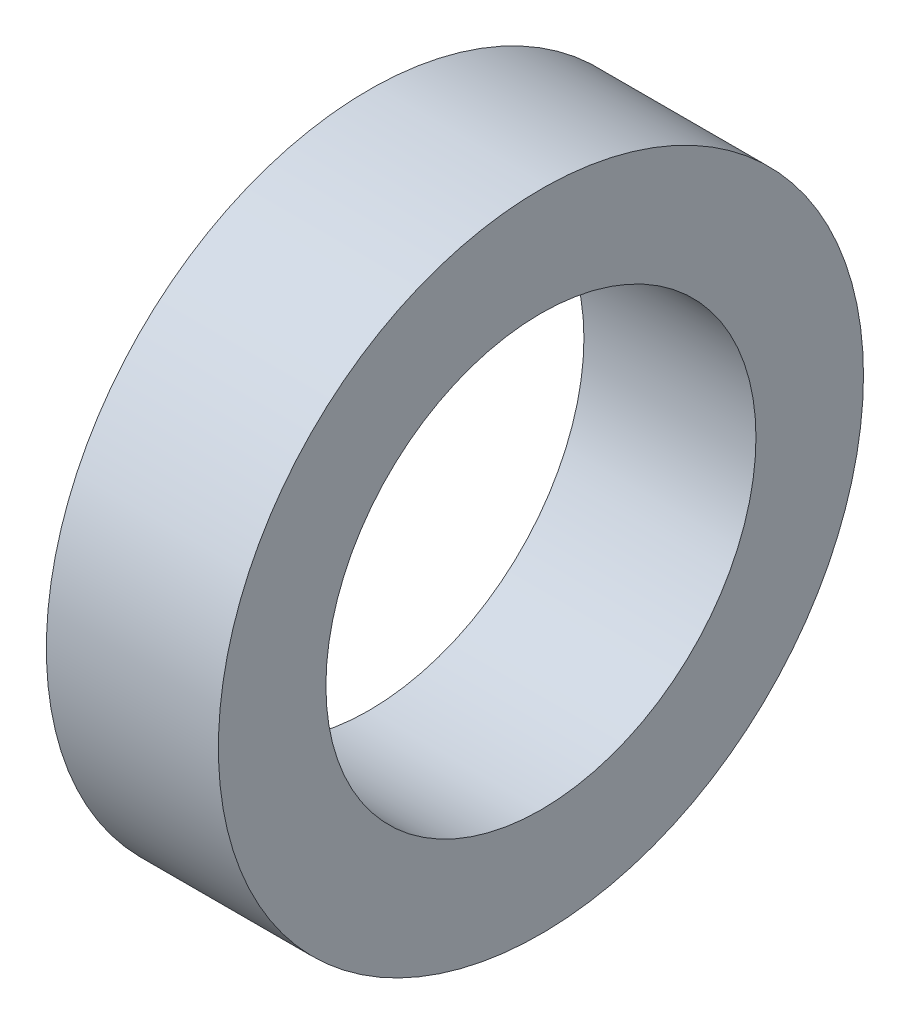
ISO-10303-21;
HEADER;
FILE_DESCRIPTION(('STEP AP214'),'2;1');
FILE_NAME('part.step','',(''),(''),'','','');
FILE_SCHEMA(('AUTOMOTIVE_DESIGN { 1 0 10303 214 1 1 1 1 }'));
ENDSEC;
DATA;
#1=APPLICATION_CONTEXT('core data for automotive mechanical design processes');
#2=APPLICATION_PROTOCOL_DEFINITION('international standard','automotive_design',2000,#1);
#3=PRODUCT_CONTEXT('',#1,'mechanical');
#4=PRODUCT('Part','Part','',(#3));
#5=PRODUCT_RELATED_PRODUCT_CATEGORY('part','',(#4));
#6=PRODUCT_DEFINITION_FORMATION('','',#4);
#7=PRODUCT_DEFINITION_CONTEXT('part definition',#1,'design');
#8=PRODUCT_DEFINITION('design','',#6,#7);
#9=PRODUCT_DEFINITION_SHAPE('','',#8);
#10=(LENGTH_UNIT() NAMED_UNIT(*) SI_UNIT(.MILLI.,.METRE.));
#11=(NAMED_UNIT(*) PLANE_ANGLE_UNIT() SI_UNIT($,.RADIAN.));
#12=(NAMED_UNIT(*) SI_UNIT($,.STERADIAN.) SOLID_ANGLE_UNIT());
#13=UNCERTAINTY_MEASURE_WITH_UNIT(LENGTH_MEASURE(1.E-05),#10,'distance_accuracy_value','');
#14=(GEOMETRIC_REPRESENTATION_CONTEXT(3) GLOBAL_UNCERTAINTY_ASSIGNED_CONTEXT((#13)) GLOBAL_UNIT_ASSIGNED_CONTEXT((#10,
#11,#12)) REPRESENTATION_CONTEXT('',''));
#15=CARTESIAN_POINT('',(0.,0.,0.));
#16=DIRECTION('',(0.,0.,1.));
#17=DIRECTION('',(1.,0.,0.));
#18=AXIS2_PLACEMENT_3D('',#15,#16,#17);
#19=CARTESIAN_POINT('',(4.,0.,0.));
#20=DIRECTION('',(-1.,0.,0.));
#21=DIRECTION('',(0.,0.,1.));
#22=AXIS2_PLACEMENT_3D('',#19,#20,#21);
#23=CYLINDRICAL_SURFACE('',#22,7.5);
#24=CARTESIAN_POINT('',(4.,0.,0.));
#25=DIRECTION('',(1.,0.,0.));
#26=DIRECTION('',(0.,0.,-1.));
#27=AXIS2_PLACEMENT_3D('',#24,#25,#26);
#28=CIRCLE('',#27,7.5);
#29=CARTESIAN_POINT('',(4.,0.,-7.5));
#30=VERTEX_POINT('',#29);
#31=EDGE_CURVE('E10',#30,#30,#28,.T.);
#32=ORIENTED_EDGE('',*,*,#31,.F.);
#33=EDGE_LOOP('',(#32));
#34=FACE_BOUND('',#33,.T.);
#35=CARTESIAN_POINT('',(0.,0.,0.));
#36=DIRECTION('',(1.,0.,0.));
#37=DIRECTION('',(0.,0.,-1.));
#38=AXIS2_PLACEMENT_3D('',#35,#36,#37);
#39=CIRCLE('',#38,7.5);
#40=CARTESIAN_POINT('',(0.,0.,-7.5));
#41=VERTEX_POINT('',#40);
#42=EDGE_CURVE('E34',#41,#41,#39,.T.);
#43=ORIENTED_EDGE('',*,*,#42,.T.);
#44=EDGE_LOOP('',(#43));
#45=FACE_BOUND('',#44,.T.);
#46=ADVANCED_FACE('F31',(#34,#45),#23,.T.);
#47=CARTESIAN_POINT('',(4.,0.,0.));
#48=DIRECTION('',(1.,0.,0.));
#49=DIRECTION('',(0.,0.,-1.));
#50=AXIS2_PLACEMENT_3D('',#47,#48,#49);
#51=PLANE('',#50);
#52=CARTESIAN_POINT('',(4.,0.,0.));
#53=DIRECTION('',(1.,0.,0.));
#54=DIRECTION('',(0.,0.,-1.));
#55=AXIS2_PLACEMENT_3D('',#52,#53,#54);
#56=CIRCLE('',#55,5.);
#57=CARTESIAN_POINT('',(4.,0.,-5.));
#58=VERTEX_POINT('',#57);
#59=EDGE_CURVE('E43',#58,#58,#56,.T.);
#60=ORIENTED_EDGE('',*,*,#59,.F.);
#61=EDGE_LOOP('',(#60));
#62=FACE_BOUND('',#61,.T.);
#63=ORIENTED_EDGE('',*,*,#31,.T.);
#64=EDGE_LOOP('',(#63));
#65=FACE_BOUND('',#64,.T.);
#66=ADVANCED_FACE('F58',(#62,#65),#51,.T.);
#67=CARTESIAN_POINT('',(0.,0.,0.));
#68=DIRECTION('',(1.,0.,0.));
#69=DIRECTION('',(0.,0.,-1.));
#70=AXIS2_PLACEMENT_3D('',#67,#68,#69);
#71=PLANE('',#70);
#72=CARTESIAN_POINT('',(0.,0.,0.));
#73=DIRECTION('',(1.,0.,0.));
#74=DIRECTION('',(0.,0.,-1.));
#75=AXIS2_PLACEMENT_3D('',#72,#73,#74);
#76=CIRCLE('',#75,5.);
#77=CARTESIAN_POINT('',(0.,0.,-5.));
#78=VERTEX_POINT('',#77);
#79=EDGE_CURVE('E41',#78,#78,#76,.T.);
#80=ORIENTED_EDGE('',*,*,#79,.T.);
#81=EDGE_LOOP('',(#80));
#82=FACE_BOUND('',#81,.T.);
#83=ORIENTED_EDGE('',*,*,#42,.F.);
#84=EDGE_LOOP('',(#83));
#85=FACE_BOUND('',#84,.T.);
#86=ADVANCED_FACE('F49',(#82,#85),#71,.F.);
#87=CARTESIAN_POINT('',(0.,0.,0.));
#88=DIRECTION('',(1.,0.,0.));
#89=DIRECTION('',(0.,0.,-1.));
#90=AXIS2_PLACEMENT_3D('',#87,#88,#89);
#91=CYLINDRICAL_SURFACE('',#90,5.);
#92=ORIENTED_EDGE('',*,*,#79,.F.);
#93=EDGE_LOOP('',(#92));
#94=FACE_BOUND('',#93,.T.);
#95=ORIENTED_EDGE('',*,*,#59,.T.);
#96=EDGE_LOOP('',(#95));
#97=FACE_BOUND('',#96,.T.);
#98=ADVANCED_FACE('F52',(#94,#97),#91,.F.);
#99=CLOSED_SHELL('',(#46,#66,#86,#98));
#100=MANIFOLD_SOLID_BREP('B2',#99);
#101=ADVANCED_BREP_SHAPE_REPRESENTATION('',(#18,#100),#14);
#102=SHAPE_DEFINITION_REPRESENTATION(#9,#101);
ENDSEC;
END-ISO-10303-21;
